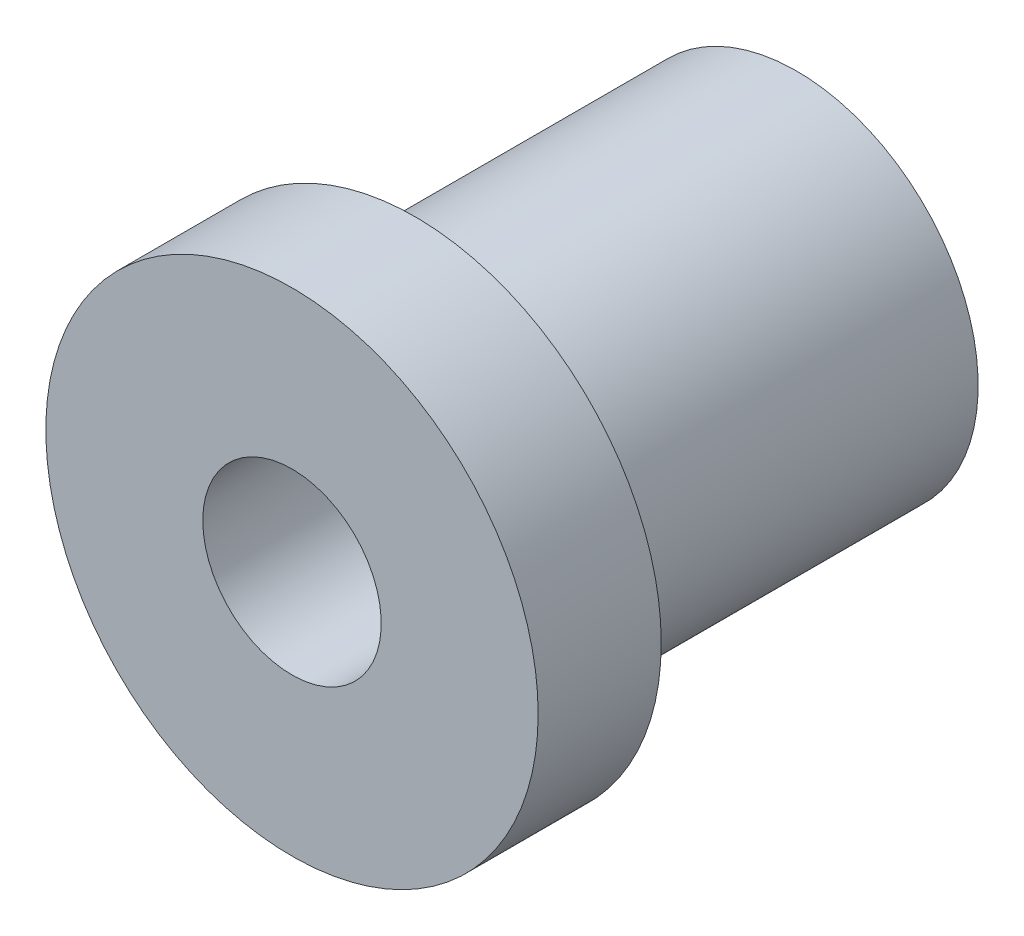
ISO-10303-21;
HEADER;
FILE_DESCRIPTION(('STEP AP214'),'2;1');
FILE_NAME('part.step','',(''),(''),'','','');
FILE_SCHEMA(('AUTOMOTIVE_DESIGN { 1 0 10303 214 1 1 1 1 }'));
ENDSEC;
DATA;
#1=APPLICATION_CONTEXT('core data for automotive mechanical design processes');
#2=APPLICATION_PROTOCOL_DEFINITION('international standard','automotive_design',2000,#1);
#3=PRODUCT_CONTEXT('',#1,'mechanical');
#4=PRODUCT('Part','Part','',(#3));
#5=PRODUCT_RELATED_PRODUCT_CATEGORY('part','',(#4));
#6=PRODUCT_DEFINITION_FORMATION('','',#4);
#7=PRODUCT_DEFINITION_CONTEXT('part definition',#1,'design');
#8=PRODUCT_DEFINITION('design','',#6,#7);
#9=PRODUCT_DEFINITION_SHAPE('','',#8);
#10=(LENGTH_UNIT() NAMED_UNIT(*) SI_UNIT(.MILLI.,.METRE.));
#11=(NAMED_UNIT(*) PLANE_ANGLE_UNIT() SI_UNIT($,.RADIAN.));
#12=(NAMED_UNIT(*) SI_UNIT($,.STERADIAN.) SOLID_ANGLE_UNIT());
#13=UNCERTAINTY_MEASURE_WITH_UNIT(LENGTH_MEASURE(1.E-05),#10,'distance_accuracy_value','');
#14=(GEOMETRIC_REPRESENTATION_CONTEXT(3) GLOBAL_UNCERTAINTY_ASSIGNED_CONTEXT((#13)) GLOBAL_UNIT_ASSIGNED_CONTEXT((#10,
#11,#12)) REPRESENTATION_CONTEXT('',''));
#15=CARTESIAN_POINT('',(0.,0.,0.));
#16=DIRECTION('',(0.,0.,1.));
#17=DIRECTION('',(1.,0.,0.));
#18=AXIS2_PLACEMENT_3D('',#15,#16,#17);
#19=CARTESIAN_POINT('',(0.,0.,-3.1));
#20=DIRECTION('',(0.,0.,1.));
#21=DIRECTION('',(1.,0.,0.));
#22=AXIS2_PLACEMENT_3D('',#19,#20,#21);
#23=PLANE('',#22);
#24=CARTESIAN_POINT('',(0.,0.,-3.1));
#25=DIRECTION('',(0.,0.,1.));
#26=DIRECTION('',(1.,0.,0.));
#27=AXIS2_PLACEMENT_3D('',#24,#25,#26);
#28=CIRCLE('',#27,2.95);
#29=CARTESIAN_POINT('',(-2.95,0.,-3.1));
#30=VERTEX_POINT('',#29);
#31=EDGE_CURVE('E37',#30,#30,#28,.T.);
#32=ORIENTED_EDGE('',*,*,#31,.F.);
#33=EDGE_LOOP('',(#32));
#34=FACE_BOUND('',#33,.T.);
#35=CARTESIAN_POINT('',(0.,0.,-3.1));
#36=DIRECTION('',(0.,0.,1.));
#37=DIRECTION('',(1.,0.,0.));
#38=AXIS2_PLACEMENT_3D('',#35,#36,#37);
#39=CIRCLE('',#38,1.45);
#40=CARTESIAN_POINT('',(-1.45,0.,-3.1));
#41=VERTEX_POINT('',#40);
#42=EDGE_CURVE('E44',#41,#41,#39,.T.);
#43=ORIENTED_EDGE('',*,*,#42,.T.);
#44=EDGE_LOOP('',(#43));
#45=FACE_BOUND('',#44,.T.);
#46=ADVANCED_FACE('F33',(#34,#45),#23,.F.);
#47=CARTESIAN_POINT('',(0.,0.,3.1));
#48=DIRECTION('',(0.,0.,-1.));
#49=DIRECTION('',(-1.,0.,0.));
#50=AXIS2_PLACEMENT_3D('',#47,#48,#49);
#51=CYLINDRICAL_SURFACE('',#50,2.95);
#52=CARTESIAN_POINT('',(0.,0.,3.1));
#53=DIRECTION('',(0.,0.,1.));
#54=DIRECTION('',(1.,0.,0.));
#55=AXIS2_PLACEMENT_3D('',#52,#53,#54);
#56=CIRCLE('',#55,2.95);
#57=CARTESIAN_POINT('',(-2.95,0.,3.1));
#58=VERTEX_POINT('',#57);
#59=EDGE_CURVE('E10',#58,#58,#56,.T.);
#60=CARTESIAN_POINT('',(-2.95,0.,3.1));
#61=CARTESIAN_POINT('',(-2.95,0.,3.03541666666667));
#62=CARTESIAN_POINT('',(-2.95,0.,2.97083333333333));
#63=CARTESIAN_POINT('',(-2.95,0.,2.84166666666667));
#64=CARTESIAN_POINT('',(-2.95,0.,2.77708333333333));
#65=CARTESIAN_POINT('',(-2.95,0.,2.64791666666667));
#66=CARTESIAN_POINT('',(-2.95,0.,2.58333333333333));
#67=CARTESIAN_POINT('',(-2.95,0.,2.45416666666667));
#68=CARTESIAN_POINT('',(-2.95,0.,2.38958333333333));
#69=CARTESIAN_POINT('',(-2.95,0.,2.26041666666667));
#70=CARTESIAN_POINT('',(-2.95,0.,2.19583333333333));
#71=CARTESIAN_POINT('',(-2.95,0.,2.06666666666667));
#72=CARTESIAN_POINT('',(-2.95,0.,2.00208333333333));
#73=CARTESIAN_POINT('',(-2.95,0.,1.87291666666667));
#74=CARTESIAN_POINT('',(-2.95,0.,1.80833333333333));
#75=CARTESIAN_POINT('',(-2.95,0.,1.67916666666667));
#76=CARTESIAN_POINT('',(-2.95,0.,1.61458333333333));
#77=CARTESIAN_POINT('',(-2.95,0.,1.48541666666667));
#78=CARTESIAN_POINT('',(-2.95,0.,1.42083333333333));
#79=CARTESIAN_POINT('',(-2.95,0.,1.29166666666667));
#80=CARTESIAN_POINT('',(-2.95,0.,1.22708333333333));
#81=CARTESIAN_POINT('',(-2.95,0.,1.09791666666667));
#82=CARTESIAN_POINT('',(-2.95,0.,1.03333333333333));
#83=CARTESIAN_POINT('',(-2.95,0.,0.904166666666667));
#84=CARTESIAN_POINT('',(-2.95,0.,0.839583333333333));
#85=CARTESIAN_POINT('',(-2.95,0.,0.710416666666667));
#86=CARTESIAN_POINT('',(-2.95,0.,0.645833333333333));
#87=CARTESIAN_POINT('',(-2.95,0.,0.516666666666667));
#88=CARTESIAN_POINT('',(-2.95,0.,0.452083333333333));
#89=CARTESIAN_POINT('',(-2.95,0.,0.322916666666667));
#90=CARTESIAN_POINT('',(-2.95,0.,0.258333333333333));
#91=CARTESIAN_POINT('',(-2.95,0.,0.129166666666667));
#92=CARTESIAN_POINT('',(-2.95,0.,0.0645833333333333));
#93=CARTESIAN_POINT('',(-2.95,0.,-0.0645833333333333));
#94=CARTESIAN_POINT('',(-2.95,0.,-0.129166666666667));
#95=CARTESIAN_POINT('',(-2.95,0.,-0.258333333333333));
#96=CARTESIAN_POINT('',(-2.95,0.,-0.322916666666667));
#97=CARTESIAN_POINT('',(-2.95,0.,-0.452083333333333));
#98=CARTESIAN_POINT('',(-2.95,0.,-0.516666666666667));
#99=CARTESIAN_POINT('',(-2.95,0.,-0.645833333333333));
#100=CARTESIAN_POINT('',(-2.95,0.,-0.710416666666667));
#101=CARTESIAN_POINT('',(-2.95,0.,-0.839583333333333));
#102=CARTESIAN_POINT('',(-2.95,0.,-0.904166666666666));
#103=CARTESIAN_POINT('',(-2.95,0.,-1.03333333333333));
#104=CARTESIAN_POINT('',(-2.95,0.,-1.09791666666667));
#105=CARTESIAN_POINT('',(-2.95,0.,-1.22708333333333));
#106=CARTESIAN_POINT('',(-2.95,0.,-1.29166666666667));
#107=CARTESIAN_POINT('',(-2.95,0.,-1.42083333333333));
#108=CARTESIAN_POINT('',(-2.95,0.,-1.48541666666667));
#109=CARTESIAN_POINT('',(-2.95,0.,-1.61458333333333));
#110=CARTESIAN_POINT('',(-2.95,0.,-1.67916666666667));
#111=CARTESIAN_POINT('',(-2.95,0.,-1.80833333333333));
#112=CARTESIAN_POINT('',(-2.95,0.,-1.87291666666667));
#113=CARTESIAN_POINT('',(-2.95,0.,-2.00208333333333));
#114=CARTESIAN_POINT('',(-2.95,0.,-2.06666666666667));
#115=CARTESIAN_POINT('',(-2.95,0.,-2.19583333333333));
#116=CARTESIAN_POINT('',(-2.95,0.,-2.26041666666667));
#117=CARTESIAN_POINT('',(-2.95,0.,-2.38958333333333));
#118=CARTESIAN_POINT('',(-2.95,0.,-2.45416666666667));
#119=CARTESIAN_POINT('',(-2.95,0.,-2.58333333333333));
#120=CARTESIAN_POINT('',(-2.95,0.,-2.64791666666667));
#121=CARTESIAN_POINT('',(-2.95,0.,-2.77708333333333));
#122=CARTESIAN_POINT('',(-2.95,0.,-2.84166666666667));
#123=CARTESIAN_POINT('',(-2.95,0.,-2.97083333333333));
#124=CARTESIAN_POINT('',(-2.95,0.,-3.03541666666667));
#125=CARTESIAN_POINT('',(-2.95,0.,-3.1));
#126=B_SPLINE_CURVE_WITH_KNOTS('',3,(#60,#61,#62,#63,#64,#65,#66,#67,#68,#69,#70,#71,#72,#73,
#74,#75,#76,#77,#78,#79,#80,#81,#82,#83,#84,#85,#86,#87,#88,#89,#90,#91,#92,#93,#94,#95,#96,#97,
#98,#99,#100,#101,#102,#103,#104,#105,#106,#107,#108,#109,#110,#111,#112,#113,#114,#115,#116,
#117,#118,#119,#120,#121,#122,#123,#124,#125),.UNSPECIFIED.,.F.,.F.,(4,2,2,2,2,2,2,2,2,2,2,2,2,
2,2,2,2,2,2,2,2,2,2,2,2,2,2,2,2,2,2,2,4),(0.,0.19375,0.3875,0.58125,0.775,0.96875,1.1625,
1.35625,1.55,1.74375,1.9375,2.13125,2.325,2.51875,2.7125,2.90625,3.1,3.29375,3.4875,3.68125,
3.875,4.06875,4.2625,4.45625,4.65,4.84375,5.0375,5.23125,5.425,5.61875,5.8125,6.00625,6.2),.UNSPECIFIED.);
#127=EDGE_CURVE('BSEAM35',#58,#30,#126,.T.);
#128=ORIENTED_EDGE('',*,*,#59,.F.);
#129=ORIENTED_EDGE('',*,*,#31,.T.);
#130=ORIENTED_EDGE('',*,*,#127,.T.);
#131=ORIENTED_EDGE('',*,*,#127,.F.);
#132=EDGE_LOOP('',(#128,#130,#129,#131));
#133=FACE_BOUND('',#132,.T.);
#134=ADVANCED_FACE('F35',(#133),#51,.T.);
#135=CARTESIAN_POINT('',(0.,0.,3.1));
#136=DIRECTION('',(0.,0.,-1.));
#137=DIRECTION('',(-1.,0.,0.));
#138=AXIS2_PLACEMENT_3D('',#135,#136,#137);
#139=CYLINDRICAL_SURFACE('',#138,1.45);
#140=CARTESIAN_POINT('',(0.,0.,5.1));
#141=DIRECTION('',(0.,0.,1.));
#142=DIRECTION('',(1.,0.,0.));
#143=AXIS2_PLACEMENT_3D('',#140,#141,#142);
#144=CIRCLE('',#143,1.45);
#145=CARTESIAN_POINT('',(-1.45,0.,5.1));
#146=VERTEX_POINT('',#145);
#147=EDGE_CURVE('E52',#146,#146,#144,.T.);
#148=CARTESIAN_POINT('',(-1.45,0.,-3.1));
#149=CARTESIAN_POINT('',(-1.45,0.,-3.01458333333333));
#150=CARTESIAN_POINT('',(-1.45,0.,-2.92916666666667));
#151=CARTESIAN_POINT('',(-1.45,0.,-2.75833333333333));
#152=CARTESIAN_POINT('',(-1.45,0.,-2.67291666666667));
#153=CARTESIAN_POINT('',(-1.45,0.,-2.50208333333333));
#154=CARTESIAN_POINT('',(-1.45,0.,-2.41666666666667));
#155=CARTESIAN_POINT('',(-1.45,0.,-2.24583333333333));
#156=CARTESIAN_POINT('',(-1.45,0.,-2.16041666666667));
#157=CARTESIAN_POINT('',(-1.45,0.,-1.98958333333333));
#158=CARTESIAN_POINT('',(-1.45,0.,-1.90416666666667));
#159=CARTESIAN_POINT('',(-1.45,0.,-1.73333333333333));
#160=CARTESIAN_POINT('',(-1.45,0.,-1.64791666666667));
#161=CARTESIAN_POINT('',(-1.45,0.,-1.47708333333333));
#162=CARTESIAN_POINT('',(-1.45,0.,-1.39166666666667));
#163=CARTESIAN_POINT('',(-1.45,0.,-1.22083333333333));
#164=CARTESIAN_POINT('',(-1.45,0.,-1.13541666666667));
#165=CARTESIAN_POINT('',(-1.45,0.,-0.964583333333333));
#166=CARTESIAN_POINT('',(-1.45,0.,-0.879166666666667));
#167=CARTESIAN_POINT('',(-1.45,0.,-0.708333333333333));
#168=CARTESIAN_POINT('',(-1.45,0.,-0.622916666666667));
#169=CARTESIAN_POINT('',(-1.45,0.,-0.452083333333334));
#170=CARTESIAN_POINT('',(-1.45,0.,-0.366666666666667));
#171=CARTESIAN_POINT('',(-1.45,0.,-0.195833333333333));
#172=CARTESIAN_POINT('',(-1.45,0.,-0.110416666666667));
#173=CARTESIAN_POINT('',(-1.45,0.,0.0604166666666668));
#174=CARTESIAN_POINT('',(-1.45,0.,0.145833333333333));
#175=CARTESIAN_POINT('',(-1.45,0.,0.316666666666667));
#176=CARTESIAN_POINT('',(-1.45,0.,0.402083333333333));
#177=CARTESIAN_POINT('',(-1.45,0.,0.572916666666667));
#178=CARTESIAN_POINT('',(-1.45,0.,0.658333333333333));
#179=CARTESIAN_POINT('',(-1.45,0.,0.829166666666667));
#180=CARTESIAN_POINT('',(-1.45,0.,0.914583333333333));
#181=CARTESIAN_POINT('',(-1.45,0.,1.08541666666667));
#182=CARTESIAN_POINT('',(-1.45,0.,1.17083333333333));
#183=CARTESIAN_POINT('',(-1.45,0.,1.34166666666667));
#184=CARTESIAN_POINT('',(-1.45,0.,1.42708333333333));
#185=CARTESIAN_POINT('',(-1.45,0.,1.59791666666667));
#186=CARTESIAN_POINT('',(-1.45,0.,1.68333333333333));
#187=CARTESIAN_POINT('',(-1.45,0.,1.85416666666667));
#188=CARTESIAN_POINT('',(-1.45,0.,1.93958333333333));
#189=CARTESIAN_POINT('',(-1.45,0.,2.11041666666667));
#190=CARTESIAN_POINT('',(-1.45,0.,2.19583333333333));
#191=CARTESIAN_POINT('',(-1.45,0.,2.36666666666667));
#192=CARTESIAN_POINT('',(-1.45,0.,2.45208333333333));
#193=CARTESIAN_POINT('',(-1.45,0.,2.62291666666667));
#194=CARTESIAN_POINT('',(-1.45,0.,2.70833333333333));
#195=CARTESIAN_POINT('',(-1.45,0.,2.87916666666667));
#196=CARTESIAN_POINT('',(-1.45,0.,2.96458333333333));
#197=CARTESIAN_POINT('',(-1.45,0.,3.13541666666667));
#198=CARTESIAN_POINT('',(-1.45,0.,3.22083333333333));
#199=CARTESIAN_POINT('',(-1.45,0.,3.39166666666667));
#200=CARTESIAN_POINT('',(-1.45,0.,3.47708333333333));
#201=CARTESIAN_POINT('',(-1.45,0.,3.64791666666667));
#202=CARTESIAN_POINT('',(-1.45,0.,3.73333333333333));
#203=CARTESIAN_POINT('',(-1.45,0.,3.90416666666667));
#204=CARTESIAN_POINT('',(-1.45,0.,3.98958333333333));
#205=CARTESIAN_POINT('',(-1.45,0.,4.16041666666667));
#206=CARTESIAN_POINT('',(-1.45,0.,4.24583333333333));
#207=CARTESIAN_POINT('',(-1.45,0.,4.41666666666667));
#208=CARTESIAN_POINT('',(-1.45,0.,4.50208333333333));
#209=CARTESIAN_POINT('',(-1.45,0.,4.67291666666667));
#210=CARTESIAN_POINT('',(-1.45,0.,4.75833333333333));
#211=CARTESIAN_POINT('',(-1.45,0.,4.92916666666667));
#212=CARTESIAN_POINT('',(-1.45,0.,5.01458333333333));
#213=CARTESIAN_POINT('',(-1.45,0.,5.1));
#214=B_SPLINE_CURVE_WITH_KNOTS('',3,(#148,#149,#150,#151,#152,#153,#154,#155,#156,#157,#158,
#159,#160,#161,#162,#163,#164,#165,#166,#167,#168,#169,#170,#171,#172,#173,#174,#175,#176,#177,
#178,#179,#180,#181,#182,#183,#184,#185,#186,#187,#188,#189,#190,#191,#192,#193,#194,#195,#196,
#197,#198,#199,#200,#201,#202,#203,#204,#205,#206,#207,#208,#209,#210,#211,#212,#213),
.UNSPECIFIED.,.F.,.F.,(4,2,2,2,2,2,2,2,2,2,2,2,2,2,2,2,2,2,2,2,2,2,2,2,2,2,2,2,2,2,2,2,4),(0.,
0.25625,0.5125,0.76875,1.025,1.28125,1.5375,1.79375,2.05,2.30625,2.5625,2.81875,3.075,3.33125,
3.5875,3.84375,4.1,4.35625,4.6125,4.86875,5.125,5.38125,5.6375,5.89375,6.15,6.40625,6.6625,
6.91875,7.175,7.43125,7.6875,7.94375,8.2),.UNSPECIFIED.);
#215=EDGE_CURVE('BSEAM58',#41,#146,#214,.T.);
#216=ORIENTED_EDGE('',*,*,#42,.F.);
#217=ORIENTED_EDGE('',*,*,#147,.T.);
#218=ORIENTED_EDGE('',*,*,#215,.T.);
#219=ORIENTED_EDGE('',*,*,#215,.F.);
#220=EDGE_LOOP('',(#216,#218,#217,#219));
#221=FACE_BOUND('',#220,.T.);
#222=ADVANCED_FACE('F58',(#221),#139,.F.);
#223=CARTESIAN_POINT('',(0.,0.,5.1));
#224=DIRECTION('',(0.,0.,1.));
#225=DIRECTION('',(1.,0.,0.));
#226=AXIS2_PLACEMENT_3D('',#223,#224,#225);
#227=PLANE('',#226);
#228=CARTESIAN_POINT('',(0.,0.,5.1));
#229=DIRECTION('',(0.,0.,1.));
#230=DIRECTION('',(1.,0.,0.));
#231=AXIS2_PLACEMENT_3D('',#228,#229,#230);
#232=CIRCLE('',#231,4.);
#233=CARTESIAN_POINT('',(4.,0.,5.1));
#234=VERTEX_POINT('',#233);
#235=EDGE_CURVE('E48',#234,#234,#232,.T.);
#236=ORIENTED_EDGE('',*,*,#235,.T.);
#237=EDGE_LOOP('',(#236));
#238=FACE_BOUND('',#237,.T.);
#239=ORIENTED_EDGE('',*,*,#147,.F.);
#240=EDGE_LOOP('',(#239));
#241=FACE_BOUND('',#240,.T.);
#242=ADVANCED_FACE('F60',(#238,#241),#227,.T.);
#243=CARTESIAN_POINT('',(0.,0.,3.1));
#244=DIRECTION('',(0.,0.,1.));
#245=DIRECTION('',(1.,0.,0.));
#246=AXIS2_PLACEMENT_3D('',#243,#244,#245);
#247=PLANE('',#246);
#248=ORIENTED_EDGE('',*,*,#59,.T.);
#249=EDGE_LOOP('',(#248));
#250=FACE_BOUND('',#249,.T.);
#251=CARTESIAN_POINT('',(0.,0.,3.1));
#252=DIRECTION('',(0.,0.,1.));
#253=DIRECTION('',(1.,0.,0.));
#254=AXIS2_PLACEMENT_3D('',#251,#252,#253);
#255=CIRCLE('',#254,4.);
#256=CARTESIAN_POINT('',(4.,0.,3.1));
#257=VERTEX_POINT('',#256);
#258=EDGE_CURVE('E49',#257,#257,#255,.T.);
#259=ORIENTED_EDGE('',*,*,#258,.F.);
#260=EDGE_LOOP('',(#259));
#261=FACE_BOUND('',#260,.T.);
#262=ADVANCED_FACE('F62',(#250,#261),#247,.F.);
#263=CARTESIAN_POINT('',(0.,0.,5.1));
#264=DIRECTION('',(0.,0.,-1.));
#265=DIRECTION('',(-1.,0.,0.));
#266=AXIS2_PLACEMENT_3D('',#263,#264,#265);
#267=CYLINDRICAL_SURFACE('',#266,4.);
#268=ORIENTED_EDGE('',*,*,#235,.F.);
#269=EDGE_LOOP('',(#268));
#270=FACE_BOUND('',#269,.T.);
#271=ORIENTED_EDGE('',*,*,#258,.T.);
#272=EDGE_LOOP('',(#271));
#273=FACE_BOUND('',#272,.T.);
#274=ADVANCED_FACE('F69',(#270,#273),#267,.T.);
#275=CLOSED_SHELL('',(#46,#134,#222,#242,#262,#274));
#276=MANIFOLD_SOLID_BREP('B2',#275);
#277=ADVANCED_BREP_SHAPE_REPRESENTATION('',(#18,#276),#14);
#278=SHAPE_DEFINITION_REPRESENTATION(#9,#277);
ENDSEC;
END-ISO-10303-21;
